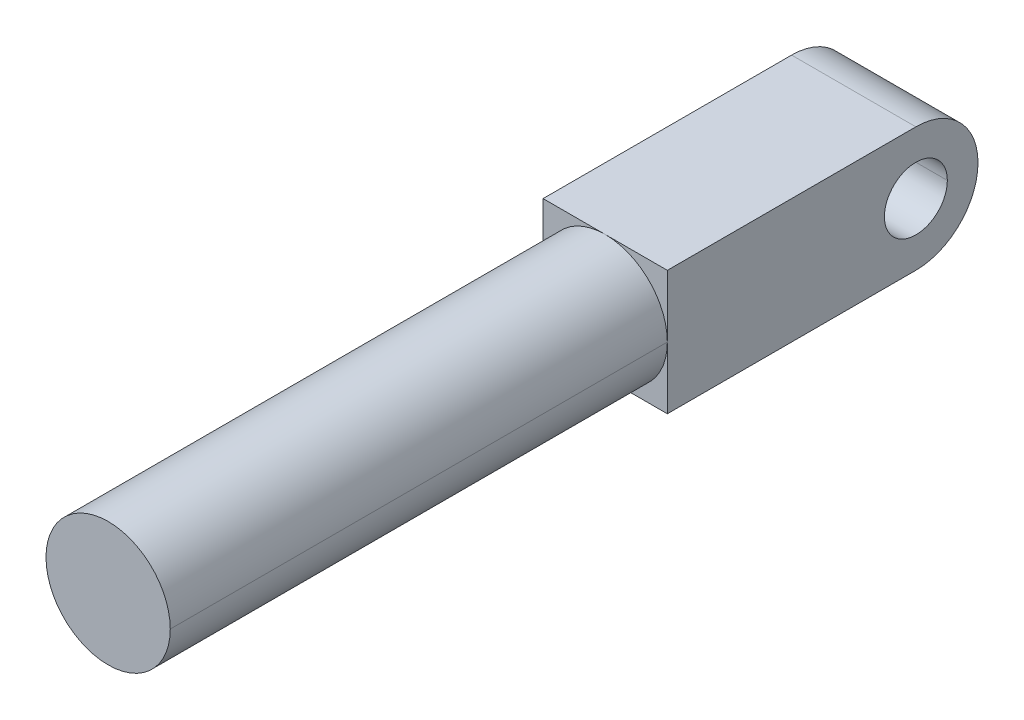
ISO-10303-21;
HEADER;
FILE_DESCRIPTION(('STEP AP214'),'2;1');
FILE_NAME('part.step','',(''),(''),'','','');
FILE_SCHEMA(('AUTOMOTIVE_DESIGN { 1 0 10303 214 1 1 1 1 }'));
ENDSEC;
DATA;
#1=APPLICATION_CONTEXT('core data for automotive mechanical design processes');
#2=APPLICATION_PROTOCOL_DEFINITION('international standard','automotive_design',2000,#1);
#3=PRODUCT_CONTEXT('',#1,'mechanical');
#4=PRODUCT('Part','Part','',(#3));
#5=PRODUCT_RELATED_PRODUCT_CATEGORY('part','',(#4));
#6=PRODUCT_DEFINITION_FORMATION('','',#4);
#7=PRODUCT_DEFINITION_CONTEXT('part definition',#1,'design');
#8=PRODUCT_DEFINITION('design','',#6,#7);
#9=PRODUCT_DEFINITION_SHAPE('','',#8);
#10=(LENGTH_UNIT() NAMED_UNIT(*) SI_UNIT(.MILLI.,.METRE.));
#11=(NAMED_UNIT(*) PLANE_ANGLE_UNIT() SI_UNIT($,.RADIAN.));
#12=(NAMED_UNIT(*) SI_UNIT($,.STERADIAN.) SOLID_ANGLE_UNIT());
#13=UNCERTAINTY_MEASURE_WITH_UNIT(LENGTH_MEASURE(1.E-05),#10,'distance_accuracy_value','');
#14=(GEOMETRIC_REPRESENTATION_CONTEXT(3) GLOBAL_UNCERTAINTY_ASSIGNED_CONTEXT((#13)) GLOBAL_UNIT_ASSIGNED_CONTEXT((#10,
#11,#12)) REPRESENTATION_CONTEXT('',''));
#15=CARTESIAN_POINT('',(0.,0.,0.));
#16=DIRECTION('',(0.,0.,1.));
#17=DIRECTION('',(1.,0.,0.));
#18=AXIS2_PLACEMENT_3D('',#15,#16,#17);
#19=CARTESIAN_POINT('',(25.,0.,300.));
#20=DIRECTION('',(0.,0.,-1.));
#21=DIRECTION('',(-1.,0.,0.));
#22=AXIS2_PLACEMENT_3D('',#19,#20,#21);
#23=CYLINDRICAL_SURFACE('',#22,25.);
#24=CARTESIAN_POINT('',(25.,0.,300.));
#25=DIRECTION('',(0.,0.,1.));
#26=DIRECTION('',(1.,0.,0.));
#27=AXIS2_PLACEMENT_3D('',#24,#25,#26);
#28=CIRCLE('',#27,25.);
#29=CARTESIAN_POINT('',(50.,0.,300.));
#30=VERTEX_POINT('',#29);
#31=CARTESIAN_POINT('',(0.,0.,300.));
#32=VERTEX_POINT('',#31);
#33=EDGE_CURVE('E162',#30,#32,#28,.T.);
#34=ORIENTED_EDGE('',*,*,#33,.F.);
#35=DIRECTION('',(0.,0.,-1.));
#36=VECTOR('',#35,1.);
#37=CARTESIAN_POINT('',(50.,0.,300.));
#38=LINE('',#37,#36);
#39=CARTESIAN_POINT('',(50.,0.,100.));
#40=VERTEX_POINT('',#39);
#41=EDGE_CURVE('E158',#30,#40,#38,.T.);
#42=ORIENTED_EDGE('',*,*,#41,.T.);
#43=CARTESIAN_POINT('',(25.,0.,100.));
#44=DIRECTION('',(0.,0.,1.));
#45=DIRECTION('',(1.,0.,0.));
#46=AXIS2_PLACEMENT_3D('',#43,#44,#45);
#47=CIRCLE('',#46,25.);
#48=CARTESIAN_POINT('',(25.,25.,100.));
#49=VERTEX_POINT('',#48);
#50=EDGE_CURVE('E10',#40,#49,#47,.T.);
#51=ORIENTED_EDGE('',*,*,#50,.T.);
#52=CARTESIAN_POINT('',(25.,0.,100.));
#53=DIRECTION('',(0.,0.,1.));
#54=DIRECTION('',(1.,0.,0.));
#55=AXIS2_PLACEMENT_3D('',#52,#53,#54);
#56=CIRCLE('',#55,25.);
#57=CARTESIAN_POINT('',(0.,0.,100.));
#58=VERTEX_POINT('',#57);
#59=EDGE_CURVE('E27',#49,#58,#56,.T.);
#60=ORIENTED_EDGE('',*,*,#59,.T.);
#61=DIRECTION('',(0.,0.,-1.));
#62=VECTOR('',#61,1.);
#63=CARTESIAN_POINT('',(0.,0.,300.));
#64=LINE('',#63,#62);
#65=EDGE_CURVE('E153',#32,#58,#64,.T.);
#66=ORIENTED_EDGE('',*,*,#65,.F.);
#67=EDGE_LOOP('',(#34,#42,#51,#60,#66));
#68=FACE_BOUND('',#67,.T.);
#69=ADVANCED_FACE('F16',(#68),#23,.T.);
#70=CARTESIAN_POINT('',(0.,0.,0.));
#71=DIRECTION('',(1.,0.,0.));
#72=DIRECTION('',(0.,0.,-1.));
#73=AXIS2_PLACEMENT_3D('',#70,#71,#72);
#74=CYLINDRICAL_SURFACE('',#73,12.6607931091888);
#75=CARTESIAN_POINT('',(0.,0.,0.));
#76=DIRECTION('',(1.,0.,0.));
#77=DIRECTION('',(0.,0.,-1.));
#78=AXIS2_PLACEMENT_3D('',#75,#76,#77);
#79=CIRCLE('',#78,12.6607931091888);
#80=CARTESIAN_POINT('',(0.,0.,12.6607931091888));
#81=VERTEX_POINT('',#80);
#82=CARTESIAN_POINT('',(0.,0.,-12.6607931091888));
#83=VERTEX_POINT('',#82);
#84=EDGE_CURVE('E176',#81,#83,#79,.T.);
#85=ORIENTED_EDGE('',*,*,#84,.F.);
#86=DIRECTION('',(1.,0.,0.));
#87=VECTOR('',#86,1.);
#88=CARTESIAN_POINT('',(0.,0.,12.6607931091888));
#89=LINE('',#88,#87);
#90=CARTESIAN_POINT('',(50.,0.,12.6607931091888));
#91=VERTEX_POINT('',#90);
#92=EDGE_CURVE('E183',#81,#91,#89,.T.);
#93=ORIENTED_EDGE('',*,*,#92,.T.);
#94=CARTESIAN_POINT('',(50.,0.,0.));
#95=DIRECTION('',(1.,0.,0.));
#96=DIRECTION('',(0.,0.,-1.));
#97=AXIS2_PLACEMENT_3D('',#94,#95,#96);
#98=CIRCLE('',#97,12.6607931091888);
#99=CARTESIAN_POINT('',(50.,0.,-12.6607931091888));
#100=VERTEX_POINT('',#99);
#101=EDGE_CURVE('E186',#91,#100,#98,.T.);
#102=ORIENTED_EDGE('',*,*,#101,.T.);
#103=DIRECTION('',(1.,0.,0.));
#104=VECTOR('',#103,1.);
#105=CARTESIAN_POINT('',(0.,0.,-12.6607931091888));
#106=LINE('',#105,#104);
#107=EDGE_CURVE('E146',#83,#100,#106,.T.);
#108=ORIENTED_EDGE('',*,*,#107,.F.);
#109=EDGE_LOOP('',(#85,#93,#102,#108));
#110=FACE_BOUND('',#109,.T.);
#111=ADVANCED_FACE('F263',(#110),#74,.F.);
#112=CARTESIAN_POINT('',(0.,0.,100.));
#113=DIRECTION('',(0.,0.,1.));
#114=DIRECTION('',(1.,0.,0.));
#115=AXIS2_PLACEMENT_3D('',#112,#113,#114);
#116=PLANE('',#115);
#117=ORIENTED_EDGE('',*,*,#50,.F.);
#118=DIRECTION('',(0.,1.,0.));
#119=VECTOR('',#118,1.);
#120=CARTESIAN_POINT('',(50.,25.,100.));
#121=LINE('',#120,#119);
#122=CARTESIAN_POINT('',(50.,25.,100.));
#123=VERTEX_POINT('',#122);
#124=EDGE_CURVE('E20',#40,#123,#121,.T.);
#125=ORIENTED_EDGE('',*,*,#124,.T.);
#126=DIRECTION('',(-1.,0.,0.));
#127=VECTOR('',#126,1.);
#128=CARTESIAN_POINT('',(0.,25.,100.));
#129=LINE('',#128,#127);
#130=EDGE_CURVE('E170',#123,#49,#129,.T.);
#131=ORIENTED_EDGE('',*,*,#130,.T.);
#132=EDGE_LOOP('',(#117,#125,#131));
#133=FACE_BOUND('',#132,.T.);
#134=ADVANCED_FACE('F247',(#133),#116,.T.);
#135=CARTESIAN_POINT('',(0.,0.,100.));
#136=DIRECTION('',(0.,0.,1.));
#137=DIRECTION('',(1.,0.,0.));
#138=AXIS2_PLACEMENT_3D('',#135,#136,#137);
#139=PLANE('',#138);
#140=ORIENTED_EDGE('',*,*,#59,.F.);
#141=DIRECTION('',(-1.,0.,0.));
#142=VECTOR('',#141,1.);
#143=CARTESIAN_POINT('',(0.,25.,100.));
#144=LINE('',#143,#142);
#145=CARTESIAN_POINT('',(0.,25.,100.));
#146=VERTEX_POINT('',#145);
#147=EDGE_CURVE('E166',#49,#146,#144,.T.);
#148=ORIENTED_EDGE('',*,*,#147,.T.);
#149=DIRECTION('',(0.,-1.,0.));
#150=VECTOR('',#149,1.);
#151=CARTESIAN_POINT('',(0.,25.,100.));
#152=LINE('',#151,#150);
#153=EDGE_CURVE('E172',#146,#58,#152,.T.);
#154=ORIENTED_EDGE('',*,*,#153,.T.);
#155=EDGE_LOOP('',(#140,#148,#154));
#156=FACE_BOUND('',#155,.T.);
#157=ADVANCED_FACE('F223',(#156),#139,.T.);
#158=CARTESIAN_POINT('',(0.,0.,100.));
#159=DIRECTION('',(0.,0.,1.));
#160=DIRECTION('',(1.,0.,0.));
#161=AXIS2_PLACEMENT_3D('',#158,#159,#160);
#162=PLANE('',#161);
#163=CARTESIAN_POINT('',(25.,0.,100.));
#164=DIRECTION('',(0.,0.,1.));
#165=DIRECTION('',(1.,0.,0.));
#166=AXIS2_PLACEMENT_3D('',#163,#164,#165);
#167=CIRCLE('',#166,25.);
#168=CARTESIAN_POINT('',(25.,-25.,100.));
#169=VERTEX_POINT('',#168);
#170=EDGE_CURVE('E151',#58,#169,#167,.T.);
#171=ORIENTED_EDGE('',*,*,#170,.F.);
#172=DIRECTION('',(0.,-1.,0.));
#173=VECTOR('',#172,1.);
#174=CARTESIAN_POINT('',(0.,25.,100.));
#175=LINE('',#174,#173);
#176=CARTESIAN_POINT('',(0.,-25.,100.));
#177=VERTEX_POINT('',#176);
#178=EDGE_CURVE('E41',#58,#177,#175,.T.);
#179=ORIENTED_EDGE('',*,*,#178,.T.);
#180=DIRECTION('',(1.,0.,0.));
#181=VECTOR('',#180,1.);
#182=CARTESIAN_POINT('',(0.,-25.,100.));
#183=LINE('',#182,#181);
#184=EDGE_CURVE('E122',#177,#169,#183,.T.);
#185=ORIENTED_EDGE('',*,*,#184,.T.);
#186=EDGE_LOOP('',(#171,#179,#185));
#187=FACE_BOUND('',#186,.T.);
#188=ADVANCED_FACE('F18',(#187),#162,.T.);
#189=CARTESIAN_POINT('',(50.,0.,0.));
#190=DIRECTION('',(-1.,0.,0.));
#191=DIRECTION('',(0.,0.,1.));
#192=AXIS2_PLACEMENT_3D('',#189,#190,#191);
#193=CYLINDRICAL_SURFACE('',#192,25.);
#194=DIRECTION('',(-1.,0.,0.));
#195=VECTOR('',#194,1.);
#196=CARTESIAN_POINT('',(0.,25.,0.));
#197=LINE('',#196,#195);
#198=CARTESIAN_POINT('',(50.,25.,0.));
#199=VERTEX_POINT('',#198);
#200=CARTESIAN_POINT('',(0.,25.,0.));
#201=VERTEX_POINT('',#200);
#202=EDGE_CURVE('E132',#199,#201,#197,.T.);
#203=ORIENTED_EDGE('',*,*,#202,.F.);
#204=CARTESIAN_POINT('',(50.,0.,0.));
#205=DIRECTION('',(1.,0.,0.));
#206=DIRECTION('',(0.,0.,-1.));
#207=AXIS2_PLACEMENT_3D('',#204,#205,#206);
#208=CIRCLE('',#207,25.);
#209=CARTESIAN_POINT('',(50.,-25.,0.));
#210=VERTEX_POINT('',#209);
#211=EDGE_CURVE('E197',#210,#199,#208,.T.);
#212=ORIENTED_EDGE('',*,*,#211,.F.);
#213=DIRECTION('',(1.,0.,0.));
#214=VECTOR('',#213,1.);
#215=CARTESIAN_POINT('',(0.,-25.,0.));
#216=LINE('',#215,#214);
#217=CARTESIAN_POINT('',(0.,-25.,0.));
#218=VERTEX_POINT('',#217);
#219=EDGE_CURVE('E119',#218,#210,#216,.T.);
#220=ORIENTED_EDGE('',*,*,#219,.F.);
#221=CARTESIAN_POINT('',(0.,0.,0.));
#222=DIRECTION('',(1.,0.,0.));
#223=DIRECTION('',(0.,0.,-1.));
#224=AXIS2_PLACEMENT_3D('',#221,#222,#223);
#225=CIRCLE('',#224,25.);
#226=EDGE_CURVE('E216',#218,#201,#225,.T.);
#227=ORIENTED_EDGE('',*,*,#226,.T.);
#228=EDGE_LOOP('',(#203,#212,#220,#227));
#229=FACE_BOUND('',#228,.T.);
#230=ADVANCED_FACE('F215',(#229),#193,.T.);
#231=CARTESIAN_POINT('',(50.,0.,0.));
#232=DIRECTION('',(1.,0.,0.));
#233=DIRECTION('',(0.,1.,0.));
#234=AXIS2_PLACEMENT_3D('',#231,#232,#233);
#235=PLANE('',#234);
#236=CARTESIAN_POINT('',(50.,0.,0.));
#237=DIRECTION('',(1.,0.,0.));
#238=DIRECTION('',(0.,0.,-1.));
#239=AXIS2_PLACEMENT_3D('',#236,#237,#238);
#240=CIRCLE('',#239,12.6607931091888);
#241=EDGE_CURVE('E138',#100,#91,#240,.T.);
#242=ORIENTED_EDGE('',*,*,#241,.F.);
#243=ORIENTED_EDGE('',*,*,#101,.F.);
#244=EDGE_LOOP('',(#242,#243));
#245=FACE_BOUND('',#244,.T.);
#246=ORIENTED_EDGE('',*,*,#211,.T.);
#247=DIRECTION('',(0.,0.,-1.));
#248=VECTOR('',#247,1.);
#249=CARTESIAN_POINT('',(50.,25.,100.));
#250=LINE('',#249,#248);
#251=EDGE_CURVE('E200',#123,#199,#250,.T.);
#252=ORIENTED_EDGE('',*,*,#251,.F.);
#253=ORIENTED_EDGE('',*,*,#124,.F.);
#254=DIRECTION('',(0.,1.,0.));
#255=VECTOR('',#254,1.);
#256=CARTESIAN_POINT('',(50.,25.,100.));
#257=LINE('',#256,#255);
#258=CARTESIAN_POINT('',(50.,-25.,100.));
#259=VERTEX_POINT('',#258);
#260=EDGE_CURVE('E126',#259,#40,#257,.T.);
#261=ORIENTED_EDGE('',*,*,#260,.F.);
#262=DIRECTION('',(0.,0.,-1.));
#263=VECTOR('',#262,1.);
#264=CARTESIAN_POINT('',(50.,-25.,100.));
#265=LINE('',#264,#263);
#266=EDGE_CURVE('E110',#259,#210,#265,.T.);
#267=ORIENTED_EDGE('',*,*,#266,.T.);
#268=EDGE_LOOP('',(#246,#252,#253,#261,#267));
#269=FACE_BOUND('',#268,.T.);
#270=ADVANCED_FACE('F127',(#245,#269),#235,.T.);
#271=CARTESIAN_POINT('',(0.,0.,0.));
#272=DIRECTION('',(1.,0.,0.));
#273=DIRECTION('',(0.,1.,0.));
#274=AXIS2_PLACEMENT_3D('',#271,#272,#273);
#275=PLANE('',#274);
#276=CARTESIAN_POINT('',(0.,0.,0.));
#277=DIRECTION('',(1.,0.,0.));
#278=DIRECTION('',(0.,0.,-1.));
#279=AXIS2_PLACEMENT_3D('',#276,#277,#278);
#280=CIRCLE('',#279,12.6607931091888);
#281=EDGE_CURVE('E156',#83,#81,#280,.T.);
#282=ORIENTED_EDGE('',*,*,#281,.T.);
#283=ORIENTED_EDGE('',*,*,#84,.T.);
#284=EDGE_LOOP('',(#282,#283));
#285=FACE_BOUND('',#284,.T.);
#286=DIRECTION('',(0.,0.,-1.));
#287=VECTOR('',#286,1.);
#288=CARTESIAN_POINT('',(0.,25.,100.));
#289=LINE('',#288,#287);
#290=EDGE_CURVE('E171',#146,#201,#289,.T.);
#291=ORIENTED_EDGE('',*,*,#290,.T.);
#292=ORIENTED_EDGE('',*,*,#226,.F.);
#293=DIRECTION('',(0.,0.,-1.));
#294=VECTOR('',#293,1.);
#295=CARTESIAN_POINT('',(0.,-25.,100.));
#296=LINE('',#295,#294);
#297=EDGE_CURVE('E164',#177,#218,#296,.T.);
#298=ORIENTED_EDGE('',*,*,#297,.F.);
#299=ORIENTED_EDGE('',*,*,#178,.F.);
#300=ORIENTED_EDGE('',*,*,#153,.F.);
#301=EDGE_LOOP('',(#291,#292,#298,#299,#300));
#302=FACE_BOUND('',#301,.T.);
#303=ADVANCED_FACE('F220',(#285,#302),#275,.F.);
#304=CARTESIAN_POINT('',(0.,-25.,100.));
#305=DIRECTION('',(0.,1.,0.));
#306=DIRECTION('',(1.,0.,0.));
#307=AXIS2_PLACEMENT_3D('',#304,#305,#306);
#308=PLANE('',#307);
#309=ORIENTED_EDGE('',*,*,#219,.T.);
#310=ORIENTED_EDGE('',*,*,#266,.F.);
#311=DIRECTION('',(1.,0.,0.));
#312=VECTOR('',#311,1.);
#313=CARTESIAN_POINT('',(0.,-25.,100.));
#314=LINE('',#313,#312);
#315=EDGE_CURVE('E115',#169,#259,#314,.T.);
#316=ORIENTED_EDGE('',*,*,#315,.F.);
#317=ORIENTED_EDGE('',*,*,#184,.F.);
#318=ORIENTED_EDGE('',*,*,#297,.T.);
#319=EDGE_LOOP('',(#309,#310,#316,#317,#318));
#320=FACE_BOUND('',#319,.T.);
#321=ADVANCED_FACE('F112',(#320),#308,.F.);
#322=CARTESIAN_POINT('',(0.,25.,100.));
#323=DIRECTION('',(0.,-1.,0.));
#324=DIRECTION('',(-1.,0.,0.));
#325=AXIS2_PLACEMENT_3D('',#322,#323,#324);
#326=PLANE('',#325);
#327=ORIENTED_EDGE('',*,*,#202,.T.);
#328=ORIENTED_EDGE('',*,*,#290,.F.);
#329=ORIENTED_EDGE('',*,*,#147,.F.);
#330=ORIENTED_EDGE('',*,*,#130,.F.);
#331=ORIENTED_EDGE('',*,*,#251,.T.);
#332=EDGE_LOOP('',(#327,#328,#329,#330,#331));
#333=FACE_BOUND('',#332,.T.);
#334=ADVANCED_FACE('F211',(#333),#326,.F.);
#335=CARTESIAN_POINT('',(0.,0.,100.));
#336=DIRECTION('',(0.,0.,1.));
#337=DIRECTION('',(1.,0.,0.));
#338=AXIS2_PLACEMENT_3D('',#335,#336,#337);
#339=PLANE('',#338);
#340=CARTESIAN_POINT('',(25.,0.,100.));
#341=DIRECTION('',(0.,0.,1.));
#342=DIRECTION('',(1.,0.,0.));
#343=AXIS2_PLACEMENT_3D('',#340,#341,#342);
#344=CIRCLE('',#343,25.);
#345=EDGE_CURVE('E135',#169,#40,#344,.T.);
#346=ORIENTED_EDGE('',*,*,#345,.F.);
#347=ORIENTED_EDGE('',*,*,#315,.T.);
#348=ORIENTED_EDGE('',*,*,#260,.T.);
#349=EDGE_LOOP('',(#346,#347,#348));
#350=FACE_BOUND('',#349,.T.);
#351=ADVANCED_FACE('F134',(#350),#339,.T.);
#352=CARTESIAN_POINT('',(0.,0.,0.));
#353=DIRECTION('',(1.,0.,0.));
#354=DIRECTION('',(0.,0.,-1.));
#355=AXIS2_PLACEMENT_3D('',#352,#353,#354);
#356=CYLINDRICAL_SURFACE('',#355,12.6607931091888);
#357=ORIENTED_EDGE('',*,*,#92,.F.);
#358=ORIENTED_EDGE('',*,*,#281,.F.);
#359=ORIENTED_EDGE('',*,*,#107,.T.);
#360=ORIENTED_EDGE('',*,*,#241,.T.);
#361=EDGE_LOOP('',(#357,#358,#359,#360));
#362=FACE_BOUND('',#361,.T.);
#363=ADVANCED_FACE('F271',(#362),#356,.F.);
#364=CARTESIAN_POINT('',(25.,0.,300.));
#365=DIRECTION('',(0.,0.,-1.));
#366=DIRECTION('',(-1.,0.,0.));
#367=AXIS2_PLACEMENT_3D('',#364,#365,#366);
#368=CYLINDRICAL_SURFACE('',#367,25.);
#369=ORIENTED_EDGE('',*,*,#41,.F.);
#370=CARTESIAN_POINT('',(25.,0.,300.));
#371=DIRECTION('',(0.,0.,1.));
#372=DIRECTION('',(1.,0.,0.));
#373=AXIS2_PLACEMENT_3D('',#370,#371,#372);
#374=CIRCLE('',#373,25.);
#375=EDGE_CURVE('E190',#32,#30,#374,.T.);
#376=ORIENTED_EDGE('',*,*,#375,.F.);
#377=ORIENTED_EDGE('',*,*,#65,.T.);
#378=ORIENTED_EDGE('',*,*,#170,.T.);
#379=ORIENTED_EDGE('',*,*,#345,.T.);
#380=EDGE_LOOP('',(#369,#376,#377,#378,#379));
#381=FACE_BOUND('',#380,.T.);
#382=ADVANCED_FACE('F253',(#381),#368,.T.);
#383=CARTESIAN_POINT('',(25.,0.,300.));
#384=DIRECTION('',(0.,0.,1.));
#385=DIRECTION('',(1.,0.,0.));
#386=AXIS2_PLACEMENT_3D('',#383,#384,#385);
#387=PLANE('',#386);
#388=ORIENTED_EDGE('',*,*,#375,.T.);
#389=ORIENTED_EDGE('',*,*,#33,.T.);
#390=EDGE_LOOP('',(#388,#389));
#391=FACE_BOUND('',#390,.T.);
#392=ADVANCED_FACE('F277',(#391),#387,.T.);
#393=CLOSED_SHELL('',(#69,#111,#134,#157,#188,#230,#270,#303,#321,#334,#351,#363,#382,#392));
#394=MANIFOLD_SOLID_BREP('B1',#393);
#395=ADVANCED_BREP_SHAPE_REPRESENTATION('',(#18,#394),#14);
#396=SHAPE_DEFINITION_REPRESENTATION(#9,#395);
ENDSEC;
END-ISO-10303-21;
